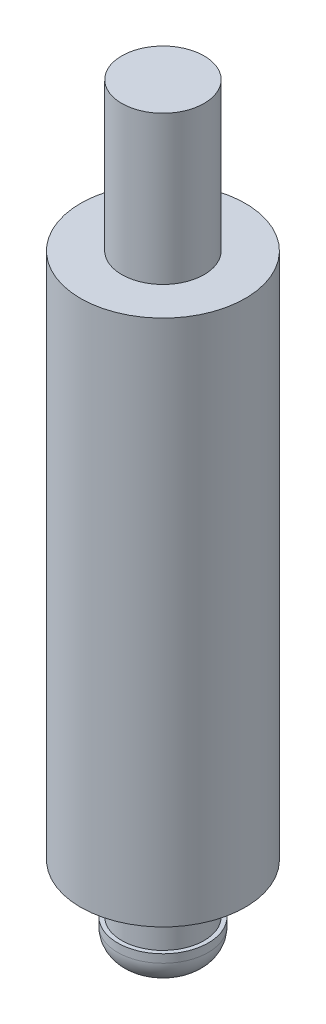
ISO-10303-21;
HEADER;
FILE_DESCRIPTION(('STEP AP214'),'2;1');
FILE_NAME('part.step','',(''),(''),'','','');
FILE_SCHEMA(('AUTOMOTIVE_DESIGN { 1 0 10303 214 1 1 1 1 }'));
ENDSEC;
DATA;
#1=APPLICATION_CONTEXT('core data for automotive mechanical design processes');
#2=APPLICATION_PROTOCOL_DEFINITION('international standard','automotive_design',2000,#1);
#3=PRODUCT_CONTEXT('',#1,'mechanical');
#4=PRODUCT('Part','Part','',(#3));
#5=PRODUCT_RELATED_PRODUCT_CATEGORY('part','',(#4));
#6=PRODUCT_DEFINITION_FORMATION('','',#4);
#7=PRODUCT_DEFINITION_CONTEXT('part definition',#1,'design');
#8=PRODUCT_DEFINITION('design','',#6,#7);
#9=PRODUCT_DEFINITION_SHAPE('','',#8);
#10=(LENGTH_UNIT() NAMED_UNIT(*) SI_UNIT(.MILLI.,.METRE.));
#11=(NAMED_UNIT(*) PLANE_ANGLE_UNIT() SI_UNIT($,.RADIAN.));
#12=(NAMED_UNIT(*) SI_UNIT($,.STERADIAN.) SOLID_ANGLE_UNIT());
#13=UNCERTAINTY_MEASURE_WITH_UNIT(LENGTH_MEASURE(1.E-05),#10,'distance_accuracy_value','');
#14=(GEOMETRIC_REPRESENTATION_CONTEXT(3) GLOBAL_UNCERTAINTY_ASSIGNED_CONTEXT((#13)) GLOBAL_UNIT_ASSIGNED_CONTEXT((#10,
#11,#12)) REPRESENTATION_CONTEXT('',''));
#15=CARTESIAN_POINT('',(0.,0.,0.));
#16=DIRECTION('',(0.,0.,1.));
#17=DIRECTION('',(1.,0.,0.));
#18=AXIS2_PLACEMENT_3D('',#15,#16,#17);
#19=CARTESIAN_POINT('',(0.,16.,0.));
#20=DIRECTION('',(0.,-1.,0.));
#21=DIRECTION('',(0.,0.,-1.));
#22=AXIS2_PLACEMENT_3D('',#19,#20,#21);
#23=CYLINDRICAL_SURFACE('',#22,2.5);
#24=CARTESIAN_POINT('',(0.,16.,0.));
#25=DIRECTION('',(0.,1.,0.));
#26=DIRECTION('',(0.,0.,1.));
#27=AXIS2_PLACEMENT_3D('',#24,#25,#26);
#28=CIRCLE('',#27,2.5);
#29=CARTESIAN_POINT('',(0.,16.,2.5));
#30=VERTEX_POINT('',#29);
#31=EDGE_CURVE('E52',#30,#30,#28,.T.);
#32=ORIENTED_EDGE('',*,*,#31,.F.);
#33=EDGE_LOOP('',(#32));
#34=FACE_BOUND('',#33,.T.);
#35=CARTESIAN_POINT('',(0.,0.,0.));
#36=DIRECTION('',(0.,1.,0.));
#37=DIRECTION('',(0.,0.,1.));
#38=AXIS2_PLACEMENT_3D('',#35,#36,#37);
#39=CIRCLE('',#38,2.5);
#40=CARTESIAN_POINT('',(0.,0.,2.5));
#41=VERTEX_POINT('',#40);
#42=EDGE_CURVE('E49',#41,#41,#39,.T.);
#43=ORIENTED_EDGE('',*,*,#42,.T.);
#44=EDGE_LOOP('',(#43));
#45=FACE_BOUND('',#44,.T.);
#46=ADVANCED_FACE('F31',(#34,#45),#23,.T.);
#47=CARTESIAN_POINT('',(0.,16.,0.));
#48=DIRECTION('',(0.,1.,0.));
#49=DIRECTION('',(0.,0.,1.));
#50=AXIS2_PLACEMENT_3D('',#47,#48,#49);
#51=PLANE('',#50);
#52=CARTESIAN_POINT('',(0.,16.,0.));
#53=DIRECTION('',(0.,1.,0.));
#54=DIRECTION('',(0.,0.,1.));
#55=AXIS2_PLACEMENT_3D('',#52,#53,#54);
#56=CIRCLE('',#55,1.25);
#57=CARTESIAN_POINT('',(0.,16.,1.25));
#58=VERTEX_POINT('',#57);
#59=EDGE_CURVE('E46',#58,#58,#56,.T.);
#60=ORIENTED_EDGE('',*,*,#59,.F.);
#61=EDGE_LOOP('',(#60));
#62=FACE_BOUND('',#61,.T.);
#63=ORIENTED_EDGE('',*,*,#31,.T.);
#64=EDGE_LOOP('',(#63));
#65=FACE_BOUND('',#64,.T.);
#66=ADVANCED_FACE('F82',(#62,#65),#51,.T.);
#67=CARTESIAN_POINT('',(0.,0.,0.));
#68=DIRECTION('',(0.,1.,0.));
#69=DIRECTION('',(0.,0.,1.));
#70=AXIS2_PLACEMENT_3D('',#67,#68,#69);
#71=PLANE('',#70);
#72=CARTESIAN_POINT('',(0.,0.,0.));
#73=DIRECTION('',(0.,-1.,0.));
#74=DIRECTION('',(0.,0.,-1.));
#75=AXIS2_PLACEMENT_3D('',#72,#73,#74);
#76=CIRCLE('',#75,1.25);
#77=CARTESIAN_POINT('',(0.,0.,-1.25));
#78=VERTEX_POINT('',#77);
#79=EDGE_CURVE('E42',#78,#78,#76,.T.);
#80=ORIENTED_EDGE('',*,*,#79,.F.);
#81=EDGE_LOOP('',(#80));
#82=FACE_BOUND('',#81,.T.);
#83=ORIENTED_EDGE('',*,*,#42,.F.);
#84=EDGE_LOOP('',(#83));
#85=FACE_BOUND('',#84,.T.);
#86=ADVANCED_FACE('F87',(#82,#85),#71,.F.);
#87=CARTESIAN_POINT('',(0.,20.5,0.));
#88=DIRECTION('',(0.,-1.,0.));
#89=DIRECTION('',(0.,0.,-1.));
#90=AXIS2_PLACEMENT_3D('',#87,#88,#89);
#91=CYLINDRICAL_SURFACE('',#90,1.25);
#92=CARTESIAN_POINT('',(0.,20.5,0.));
#93=DIRECTION('',(0.,1.,0.));
#94=DIRECTION('',(0.,0.,1.));
#95=AXIS2_PLACEMENT_3D('',#92,#93,#94);
#96=CIRCLE('',#95,1.25);
#97=CARTESIAN_POINT('',(0.,20.5,1.25));
#98=VERTEX_POINT('',#97);
#99=EDGE_CURVE('E53',#98,#98,#96,.T.);
#100=ORIENTED_EDGE('',*,*,#99,.F.);
#101=EDGE_LOOP('',(#100));
#102=FACE_BOUND('',#101,.T.);
#103=ORIENTED_EDGE('',*,*,#59,.T.);
#104=EDGE_LOOP('',(#103));
#105=FACE_BOUND('',#104,.T.);
#106=ADVANCED_FACE('F94',(#102,#105),#91,.T.);
#107=CARTESIAN_POINT('',(0.,20.5,0.));
#108=DIRECTION('',(0.,1.,0.));
#109=DIRECTION('',(0.,0.,1.));
#110=AXIS2_PLACEMENT_3D('',#107,#108,#109);
#111=PLANE('',#110);
#112=ORIENTED_EDGE('',*,*,#99,.T.);
#113=EDGE_LOOP('',(#112));
#114=FACE_BOUND('',#113,.T.);
#115=ADVANCED_FACE('F99',(#114),#111,.T.);
#116=CARTESIAN_POINT('',(0.,-1.5,0.));
#117=DIRECTION('',(0.,1.,0.));
#118=DIRECTION('',(0.,0.,1.));
#119=AXIS2_PLACEMENT_3D('',#116,#117,#118);
#120=CYLINDRICAL_SURFACE('',#119,1.25);
#121=CARTESIAN_POINT('',(0.,-1.5,0.));
#122=DIRECTION('',(0.,-1.,0.));
#123=DIRECTION('',(0.,0.,-1.));
#124=AXIS2_PLACEMENT_3D('',#121,#122,#123);
#125=CIRCLE('',#124,1.25);
#126=CARTESIAN_POINT('',(0.,-1.5,-1.25));
#127=VERTEX_POINT('',#126);
#128=EDGE_CURVE('E59',#127,#127,#125,.T.);
#129=ORIENTED_EDGE('',*,*,#128,.F.);
#130=EDGE_LOOP('',(#129));
#131=FACE_BOUND('',#130,.T.);
#132=ORIENTED_EDGE('',*,*,#79,.T.);
#133=EDGE_LOOP('',(#132));
#134=FACE_BOUND('',#133,.T.);
#135=ADVANCED_FACE('F103',(#131,#134),#120,.T.);
#136=CARTESIAN_POINT('',(0.,-2.5,0.));
#137=DIRECTION('',(0.,1.,0.));
#138=DIRECTION('',(0.,0.,1.));
#139=AXIS2_PLACEMENT_3D('',#136,#137,#138);
#140=CYLINDRICAL_SURFACE('',#139,1.375);
#141=CARTESIAN_POINT('',(0.,-1.75,0.));
#142=DIRECTION('',(0.,-1.,0.));
#143=DIRECTION('',(0.,0.,-1.));
#144=AXIS2_PLACEMENT_3D('',#141,#142,#143);
#145=CIRCLE('',#144,1.375);
#146=CARTESIAN_POINT('',(0.,-1.75,-1.375));
#147=VERTEX_POINT('',#146);
#148=EDGE_CURVE('E10',#147,#147,#145,.F.);
#149=ORIENTED_EDGE('',*,*,#148,.T.);
#150=EDGE_LOOP('',(#149));
#151=FACE_BOUND('',#150,.T.);
#152=CARTESIAN_POINT('',(0.,-1.5,0.));
#153=DIRECTION('',(0.,-1.,0.));
#154=DIRECTION('',(0.,0.,-1.));
#155=AXIS2_PLACEMENT_3D('',#152,#153,#154);
#156=CIRCLE('',#155,1.375);
#157=CARTESIAN_POINT('',(0.,-1.5,-1.375));
#158=VERTEX_POINT('',#157);
#159=EDGE_CURVE('E63',#158,#158,#156,.T.);
#160=ORIENTED_EDGE('',*,*,#159,.T.);
#161=EDGE_LOOP('',(#160));
#162=FACE_BOUND('',#161,.T.);
#163=ADVANCED_FACE('F67',(#151,#162),#140,.T.);
#164=CARTESIAN_POINT('',(0.,-2.5,0.));
#165=DIRECTION('',(0.,-1.,0.));
#166=DIRECTION('',(0.,0.,-1.));
#167=AXIS2_PLACEMENT_3D('',#164,#165,#166);
#168=PLANE('',#167);
#169=CARTESIAN_POINT('',(0.,-2.5,0.));
#170=DIRECTION('',(0.,-1.,0.));
#171=DIRECTION('',(0.,0.,-1.));
#172=AXIS2_PLACEMENT_3D('',#169,#170,#171);
#173=CIRCLE('',#172,0.625);
#174=CARTESIAN_POINT('',(0.,-2.5,-0.625));
#175=VERTEX_POINT('',#174);
#176=EDGE_CURVE('E38',#175,#175,#173,.T.);
#177=ORIENTED_EDGE('',*,*,#176,.T.);
#178=EDGE_LOOP('',(#177));
#179=FACE_BOUND('',#178,.T.);
#180=ADVANCED_FACE('F71',(#179),#168,.T.);
#181=CARTESIAN_POINT('',(0.,-1.5,0.));
#182=DIRECTION('',(0.,-1.,0.));
#183=DIRECTION('',(0.,0.,-1.));
#184=AXIS2_PLACEMENT_3D('',#181,#182,#183);
#185=PLANE('',#184);
#186=ORIENTED_EDGE('',*,*,#128,.T.);
#187=EDGE_LOOP('',(#186));
#188=FACE_BOUND('',#187,.T.);
#189=ORIENTED_EDGE('',*,*,#159,.F.);
#190=EDGE_LOOP('',(#189));
#191=FACE_BOUND('',#190,.T.);
#192=ADVANCED_FACE('F69',(#188,#191),#185,.F.);
#193=CARTESIAN_POINT('',(0.,-1.75,0.));
#194=DIRECTION('',(0.,-1.,0.));
#195=DIRECTION('',(0.,0.,-1.));
#196=AXIS2_PLACEMENT_3D('',#193,#194,#195);
#197=DEGENERATE_TOROIDAL_SURFACE('',#196,0.625,0.75,.T.);
#198=ORIENTED_EDGE('',*,*,#148,.F.);
#199=EDGE_LOOP('',(#198));
#200=FACE_BOUND('',#199,.T.);
#201=ORIENTED_EDGE('',*,*,#176,.F.);
#202=EDGE_LOOP('',(#201));
#203=FACE_BOUND('',#202,.T.);
#204=ADVANCED_FACE('F33',(#200,#203),#197,.T.);
#205=CLOSED_SHELL('',(#46,#66,#86,#106,#115,#135,#163,#180,#192,#204));
#206=MANIFOLD_SOLID_BREP('B2',#205);
#207=ADVANCED_BREP_SHAPE_REPRESENTATION('',(#18,#206),#14);
#208=SHAPE_DEFINITION_REPRESENTATION(#9,#207);
ENDSEC;
END-ISO-10303-21;
